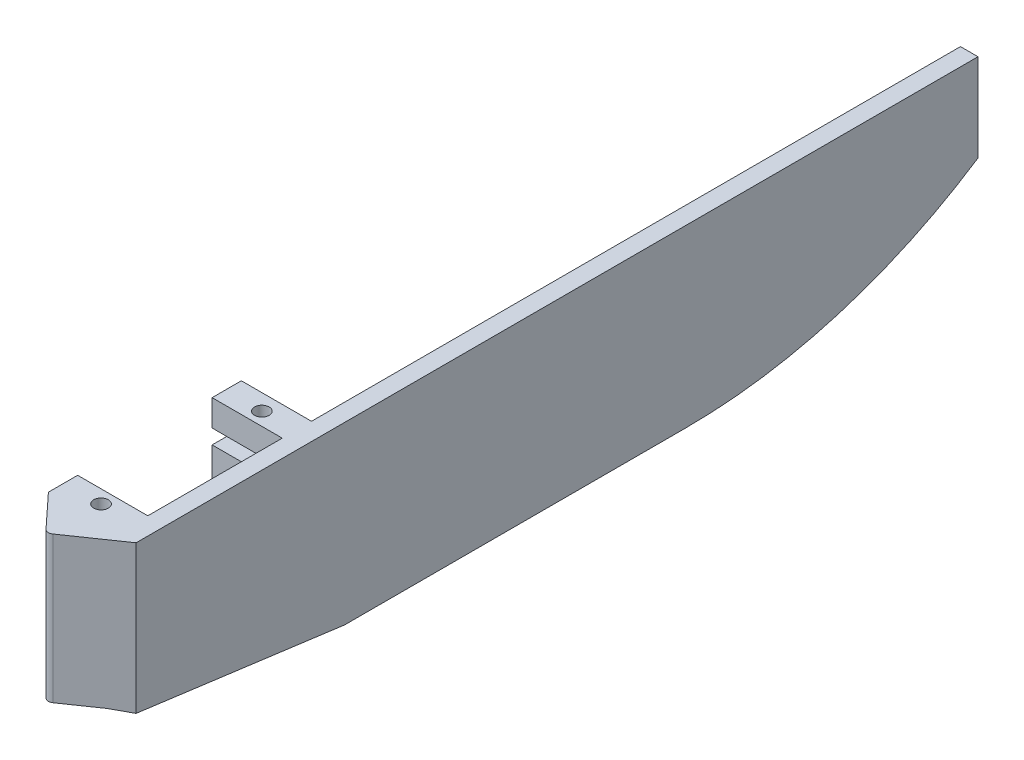
ISO-10303-21;
HEADER;
FILE_DESCRIPTION(('STEP AP214'),'2;1');
FILE_NAME('part.step','',(''),(''),'','','');
FILE_SCHEMA(('AUTOMOTIVE_DESIGN { 1 0 10303 214 1 1 1 1 }'));
ENDSEC;
DATA;
#1=APPLICATION_CONTEXT('core data for automotive mechanical design processes');
#2=APPLICATION_PROTOCOL_DEFINITION('international standard','automotive_design',2000,#1);
#3=PRODUCT_CONTEXT('',#1,'mechanical');
#4=PRODUCT('Part','Part','',(#3));
#5=PRODUCT_RELATED_PRODUCT_CATEGORY('part','',(#4));
#6=PRODUCT_DEFINITION_FORMATION('','',#4);
#7=PRODUCT_DEFINITION_CONTEXT('part definition',#1,'design');
#8=PRODUCT_DEFINITION('design','',#6,#7);
#9=PRODUCT_DEFINITION_SHAPE('','',#8);
#10=(LENGTH_UNIT() NAMED_UNIT(*) SI_UNIT(.MILLI.,.METRE.));
#11=(NAMED_UNIT(*) PLANE_ANGLE_UNIT() SI_UNIT($,.RADIAN.));
#12=(NAMED_UNIT(*) SI_UNIT($,.STERADIAN.) SOLID_ANGLE_UNIT());
#13=UNCERTAINTY_MEASURE_WITH_UNIT(LENGTH_MEASURE(1.E-05),#10,'distance_accuracy_value','');
#14=(GEOMETRIC_REPRESENTATION_CONTEXT(3) GLOBAL_UNCERTAINTY_ASSIGNED_CONTEXT((#13)) GLOBAL_UNIT_ASSIGNED_CONTEXT((#10,
#11,#12)) REPRESENTATION_CONTEXT('',''));
#15=CARTESIAN_POINT('',(0.,0.,0.));
#16=DIRECTION('',(0.,0.,1.));
#17=DIRECTION('',(1.,0.,0.));
#18=AXIS2_PLACEMENT_3D('',#15,#16,#17);
#19=CARTESIAN_POINT('',(3.,0.,0.));
#20=DIRECTION('',(0.,1.,0.));
#21=DIRECTION('',(0.,0.,1.));
#22=AXIS2_PLACEMENT_3D('',#19,#20,#21);
#23=PLANE('',#22);
#24=DIRECTION('',(1.,0.,0.));
#25=VECTOR('',#24,1.);
#26=CARTESIAN_POINT('',(-11.,0.,-100.));
#27=LINE('',#26,#25);
#28=CARTESIAN_POINT('',(-3.,0.,-100.));
#29=VERTEX_POINT('',#28);
#30=CARTESIAN_POINT('',(0.,0.,-100.));
#31=VERTEX_POINT('',#30);
#32=EDGE_CURVE('E250',#29,#31,#27,.T.);
#33=ORIENTED_EDGE('',*,*,#32,.T.);
#34=DIRECTION('',(0.,0.,1.));
#35=VECTOR('',#34,1.);
#36=CARTESIAN_POINT('',(0.,0.,0.));
#37=LINE('',#36,#35);
#38=CARTESIAN_POINT('',(0.,0.,-41.6596314448645));
#39=VERTEX_POINT('',#38);
#40=EDGE_CURVE('E75',#31,#39,#37,.T.);
#41=ORIENTED_EDGE('',*,*,#40,.T.);
#42=DIRECTION('',(1.,0.,0.));
#43=VECTOR('',#42,1.);
#44=CARTESIAN_POINT('',(-11.,0.,-41.6596314448645));
#45=LINE('',#44,#43);
#46=CARTESIAN_POINT('',(-3.,0.,-41.6596314448645));
#47=VERTEX_POINT('',#46);
#48=EDGE_CURVE('E245',#47,#39,#45,.T.);
#49=ORIENTED_EDGE('',*,*,#48,.F.);
#50=DIRECTION('',(0.,0.,-1.));
#51=VECTOR('',#50,1.);
#52=CARTESIAN_POINT('',(-3.,0.,0.));
#53=LINE('',#52,#51);
#54=EDGE_CURVE('E430',#47,#29,#53,.T.);
#55=ORIENTED_EDGE('',*,*,#54,.T.);
#56=EDGE_LOOP('',(#33,#41,#49,#55));
#57=FACE_BOUND('',#56,.T.);
#58=ADVANCED_FACE('F61',(#57),#23,.F.);
#59=CARTESIAN_POINT('',(-3.,0.,0.));
#60=DIRECTION('',(1.,0.,0.));
#61=DIRECTION('',(0.,0.,1.));
#62=AXIS2_PLACEMENT_3D('',#59,#60,#61);
#63=PLANE('',#62);
#64=DIRECTION('',(0.,0.,1.));
#65=VECTOR('',#64,1.);
#66=CARTESIAN_POINT('',(-3.,23.000001474005,-34.0036422578905));
#67=LINE('',#66,#65);
#68=CARTESIAN_POINT('',(-3.,23.000001474005,-39.0036422578905));
#69=VERTEX_POINT('',#68);
#70=CARTESIAN_POINT('',(-3.,23.000001474005,-34.0036422578905));
#71=VERTEX_POINT('',#70);
#72=EDGE_CURVE('E320',#69,#71,#67,.T.);
#73=ORIENTED_EDGE('',*,*,#72,.T.);
#74=DIRECTION('',(0.,-1.,0.));
#75=VECTOR('',#74,1.);
#76=CARTESIAN_POINT('',(-3.,23.000001474005,-34.0036422578905));
#77=LINE('',#76,#75);
#78=CARTESIAN_POINT('',(-3.,18.000001474005,-34.0036422578905));
#79=VERTEX_POINT('',#78);
#80=EDGE_CURVE('E303',#71,#79,#77,.T.);
#81=ORIENTED_EDGE('',*,*,#80,.T.);
#82=DIRECTION('',(0.,0.,-1.));
#83=VECTOR('',#82,1.);
#84=CARTESIAN_POINT('',(-3.,18.000001474005,-34.0036422578905));
#85=LINE('',#84,#83);
#86=CARTESIAN_POINT('',(-3.,18.000001474005,-39.0036422578905));
#87=VERTEX_POINT('',#86);
#88=EDGE_CURVE('E308',#79,#87,#85,.T.);
#89=ORIENTED_EDGE('',*,*,#88,.T.);
#90=DIRECTION('',(0.,1.,0.));
#91=VECTOR('',#90,1.);
#92=CARTESIAN_POINT('',(-3.,23.000001474005,-39.0036422578905));
#93=LINE('',#92,#91);
#94=EDGE_CURVE('E323',#87,#69,#93,.T.);
#95=ORIENTED_EDGE('',*,*,#94,.T.);
#96=EDGE_LOOP('',(#73,#81,#89,#95));
#97=FACE_BOUND('',#96,.T.);
#98=CARTESIAN_POINT('',(-3.,90.8333333333333,-100.));
#99=DIRECTION('',(-1.,0.,0.));
#100=DIRECTION('',(0.,0.,1.));
#101=AXIS2_PLACEMENT_3D('',#98,#99,#100);
#102=CIRCLE('',#101,90.8333333333333);
#103=CARTESIAN_POINT('',(-3.,15.,-150.));
#104=VERTEX_POINT('',#103);
#105=EDGE_CURVE('E439',#104,#29,#102,.T.);
#106=ORIENTED_EDGE('',*,*,#105,.T.);
#107=ORIENTED_EDGE('',*,*,#54,.F.);
#108=DIRECTION('',(0.,0.131367240534839,0.991333772305908));
#109=VECTOR('',#108,1.);
#110=CARTESIAN_POINT('',(-3.,5.,-3.92823934627651));
#111=LINE('',#110,#109);
#112=CARTESIAN_POINT('',(-3.,5.,-3.92823934627651));
#113=VERTEX_POINT('',#112);
#114=EDGE_CURVE('E443',#47,#113,#111,.T.);
#115=ORIENTED_EDGE('',*,*,#114,.T.);
#116=DIRECTION('',(0.,0.,-1.));
#117=VECTOR('',#116,1.);
#118=CARTESIAN_POINT('',(-3.,5.,7.99635774210946));
#119=LINE('',#118,#117);
#120=CARTESIAN_POINT('',(-3.,5.,-6.00364225789055));
#121=VERTEX_POINT('',#120);
#122=EDGE_CURVE('E457',#113,#121,#119,.T.);
#123=ORIENTED_EDGE('',*,*,#122,.T.);
#124=DIRECTION('',(0.,1.,0.));
#125=VECTOR('',#124,1.);
#126=CARTESIAN_POINT('',(-3.,18.000001474005,-6.00364225789055));
#127=LINE('',#126,#125);
#128=CARTESIAN_POINT('',(-3.,18.000001474005,-6.00364225789055));
#129=VERTEX_POINT('',#128);
#130=EDGE_CURVE('E371',#121,#129,#127,.T.);
#131=ORIENTED_EDGE('',*,*,#130,.T.);
#132=DIRECTION('',(0.,0.,-1.));
#133=VECTOR('',#132,1.);
#134=CARTESIAN_POINT('',(-3.,18.000001474005,-6.00364225789055));
#135=LINE('',#134,#133);
#136=CARTESIAN_POINT('',(-3.,18.000001474005,-11.0036422578906));
#137=VERTEX_POINT('',#136);
#138=EDGE_CURVE('E406',#129,#137,#135,.T.);
#139=ORIENTED_EDGE('',*,*,#138,.T.);
#140=DIRECTION('',(0.,1.,0.));
#141=VECTOR('',#140,1.);
#142=CARTESIAN_POINT('',(-3.,23.000001474005,-11.0036422578905));
#143=LINE('',#142,#141);
#144=CARTESIAN_POINT('',(-3.,23.000001474005,-11.0036422578905));
#145=VERTEX_POINT('',#144);
#146=EDGE_CURVE('E403',#137,#145,#143,.T.);
#147=ORIENTED_EDGE('',*,*,#146,.T.);
#148=DIRECTION('',(0.,0.,1.));
#149=VECTOR('',#148,1.);
#150=CARTESIAN_POINT('',(-3.,23.000001474005,-6.00364225789055));
#151=LINE('',#150,#149);
#152=CARTESIAN_POINT('',(-3.,23.000001474005,-6.00364225789055));
#153=VERTEX_POINT('',#152);
#154=EDGE_CURVE('E400',#145,#153,#151,.T.);
#155=ORIENTED_EDGE('',*,*,#154,.T.);
#156=DIRECTION('',(0.,1.,0.));
#157=VECTOR('',#156,1.);
#158=CARTESIAN_POINT('',(-3.,25.500001474005,-6.00364225789055));
#159=LINE('',#158,#157);
#160=CARTESIAN_POINT('',(-3.,25.500001474005,-6.00364225789055));
#161=VERTEX_POINT('',#160);
#162=EDGE_CURVE('E397',#153,#161,#159,.T.);
#163=ORIENTED_EDGE('',*,*,#162,.T.);
#164=DIRECTION('',(0.,0.,-1.));
#165=VECTOR('',#164,1.);
#166=CARTESIAN_POINT('',(-3.,25.500001474005,-6.00364225789055));
#167=LINE('',#166,#165);
#168=CARTESIAN_POINT('',(-3.,25.500001474005,-11.));
#169=VERTEX_POINT('',#168);
#170=EDGE_CURVE('E394',#161,#169,#167,.T.);
#171=ORIENTED_EDGE('',*,*,#170,.T.);
#172=DIRECTION('',(0.,1.,0.));
#173=VECTOR('',#172,1.);
#174=CARTESIAN_POINT('',(-3.,30.,-11.));
#175=LINE('',#174,#173);
#176=CARTESIAN_POINT('',(-3.,30.,-11.));
#177=VERTEX_POINT('',#176);
#178=EDGE_CURVE('E366',#169,#177,#175,.T.);
#179=ORIENTED_EDGE('',*,*,#178,.T.);
#180=DIRECTION('',(0.,0.,1.));
#181=VECTOR('',#180,1.);
#182=CARTESIAN_POINT('',(-3.,30.,0.));
#183=LINE('',#182,#181);
#184=CARTESIAN_POINT('',(-3.,30.,-34.));
#185=VERTEX_POINT('',#184);
#186=EDGE_CURVE('E426',#185,#177,#183,.T.);
#187=ORIENTED_EDGE('',*,*,#186,.F.);
#188=DIRECTION('',(0.,-1.,0.));
#189=VECTOR('',#188,1.);
#190=CARTESIAN_POINT('',(-3.,30.,-34.));
#191=LINE('',#190,#189);
#192=CARTESIAN_POINT('',(-3.,25.5,-34.));
#193=VERTEX_POINT('',#192);
#194=EDGE_CURVE('E336',#185,#193,#191,.T.);
#195=ORIENTED_EDGE('',*,*,#194,.T.);
#196=DIRECTION('',(0.,0.,-1.));
#197=VECTOR('',#196,1.);
#198=CARTESIAN_POINT('',(-3.,25.5,-34.));
#199=LINE('',#198,#197);
#200=CARTESIAN_POINT('',(-3.,25.5,-39.));
#201=VERTEX_POINT('',#200);
#202=EDGE_CURVE('E341',#193,#201,#199,.T.);
#203=ORIENTED_EDGE('',*,*,#202,.T.);
#204=DIRECTION('',(0.,1.,0.));
#205=VECTOR('',#204,1.);
#206=CARTESIAN_POINT('',(-3.,30.,-39.));
#207=LINE('',#206,#205);
#208=CARTESIAN_POINT('',(-3.,30.,-39.));
#209=VERTEX_POINT('',#208);
#210=EDGE_CURVE('E353',#201,#209,#207,.T.);
#211=ORIENTED_EDGE('',*,*,#210,.T.);
#212=CARTESIAN_POINT('',(-3.,30.,-150.));
#213=VERTEX_POINT('',#212);
#214=EDGE_CURVE('E427',#213,#209,#183,.T.);
#215=ORIENTED_EDGE('',*,*,#214,.F.);
#216=DIRECTION('',(0.,1.,0.));
#217=VECTOR('',#216,1.);
#218=CARTESIAN_POINT('',(-3.,0.,-150.));
#219=LINE('',#218,#217);
#220=EDGE_CURVE('E242',#104,#213,#219,.T.);
#221=ORIENTED_EDGE('',*,*,#220,.F.);
#222=EDGE_LOOP('',(#106,#107,#115,#123,#131,#139,#147,#155,#163,#171,#179,#187,#195,#203,#211,
#215,#221));
#223=FACE_BOUND('',#222,.T.);
#224=ADVANCED_FACE('F441',(#97,#223),#63,.F.);
#225=CARTESIAN_POINT('',(3.,0.,-150.));
#226=DIRECTION('',(0.,0.,1.));
#227=DIRECTION('',(0.,-1.,0.));
#228=AXIS2_PLACEMENT_3D('',#225,#226,#227);
#229=PLANE('',#228);
#230=DIRECTION('',(-1.,0.,0.));
#231=VECTOR('',#230,1.);
#232=CARTESIAN_POINT('',(3.,30.,-150.));
#233=LINE('',#232,#231);
#234=CARTESIAN_POINT('',(0.,30.,-150.));
#235=VERTEX_POINT('',#234);
#236=EDGE_CURVE('E234',#235,#213,#233,.T.);
#237=ORIENTED_EDGE('',*,*,#236,.F.);
#238=DIRECTION('',(0.,-1.,0.));
#239=VECTOR('',#238,1.);
#240=CARTESIAN_POINT('',(0.,0.,-150.));
#241=LINE('',#240,#239);
#242=CARTESIAN_POINT('',(0.,15.,-150.));
#243=VERTEX_POINT('',#242);
#244=EDGE_CURVE('E221',#235,#243,#241,.T.);
#245=ORIENTED_EDGE('',*,*,#244,.T.);
#246=DIRECTION('',(1.,0.,0.));
#247=VECTOR('',#246,1.);
#248=CARTESIAN_POINT('',(-11.,15.,-150.));
#249=LINE('',#248,#247);
#250=EDGE_CURVE('E247',#243,#104,#249,.F.);
#251=ORIENTED_EDGE('',*,*,#250,.T.);
#252=ORIENTED_EDGE('',*,*,#220,.T.);
#253=EDGE_LOOP('',(#237,#245,#251,#252));
#254=FACE_BOUND('',#253,.T.);
#255=ADVANCED_FACE('F240',(#254),#229,.F.);
#256=CARTESIAN_POINT('',(-2.80553359357088,-3.00000000000002,-4.0625352960468));
#257=DIRECTION('',(-0.568252394620736,0.,-0.822854310317324));
#258=DIRECTION('',(-0.822854310317324,0.,0.568252394620736));
#259=AXIS2_PLACEMENT_3D('',#256,#257,#258);
#260=PLANE('',#259);
#261=DIRECTION('',(-0.820531211655288,0.075089741146122,0.566648093153161));
#262=VECTOR('',#261,1.);
#263=CARTESIAN_POINT('',(-2.31372227613483,4.93719627491631,-4.40217374155344));
#264=LINE('',#263,#262);
#265=CARTESIAN_POINT('',(0.,4.72545928754627,-6.));
#266=VERTEX_POINT('',#265);
#267=EDGE_CURVE('E446',#266,#113,#264,.T.);
#268=ORIENTED_EDGE('',*,*,#267,.F.);
#269=DIRECTION('',(0.,1.,0.));
#270=VECTOR('',#269,1.);
#271=CARTESIAN_POINT('',(0.,0.,-6.));
#272=LINE('',#271,#270);
#273=CARTESIAN_POINT('',(0.,30.,-6.));
#274=VERTEX_POINT('',#273);
#275=EDGE_CURVE('E244',#266,#274,#272,.T.);
#276=ORIENTED_EDGE('',*,*,#275,.T.);
#277=DIRECTION('',(-0.822854310317324,0.,0.568252394620736));
#278=VECTOR('',#277,1.);
#279=CARTESIAN_POINT('',(-2.80553359357088,30.,-4.0625352960468));
#280=LINE('',#279,#278);
#281=CARTESIAN_POINT('',(-8.43174760537926,30.,-0.177145689682673));
#282=VERTEX_POINT('',#281);
#283=EDGE_CURVE('E238',#274,#282,#280,.T.);
#284=ORIENTED_EDGE('',*,*,#283,.T.);
#285=DIRECTION('',(0.,1.,0.));
#286=VECTOR('',#285,1.);
#287=CARTESIAN_POINT('',(-8.43174760537926,-3.00000000000002,-0.177145689682673));
#288=LINE('',#287,#286);
#289=CARTESIAN_POINT('',(-8.43174760537926,5.,-0.177145689682676));
#290=VERTEX_POINT('',#289);
#291=EDGE_CURVE('E277',#290,#282,#288,.T.);
#292=ORIENTED_EDGE('',*,*,#291,.F.);
#293=DIRECTION('',(-0.822854310317324,0.,0.568252394620736));
#294=VECTOR('',#293,1.);
#295=CARTESIAN_POINT('',(-2.80553359357088,5.,-4.0625352960468));
#296=LINE('',#295,#294);
#297=EDGE_CURVE('E272',#113,#290,#296,.T.);
#298=ORIENTED_EDGE('',*,*,#297,.F.);
#299=EDGE_LOOP('',(#268,#276,#284,#292,#298));
#300=FACE_BOUND('',#299,.T.);
#301=ADVANCED_FACE('F466',(#300),#260,.F.);
#302=CARTESIAN_POINT('',(-15.,0.,0.));
#303=DIRECTION('',(-1.,0.,0.));
#304=DIRECTION('',(0.,0.,-1.));
#305=AXIS2_PLACEMENT_3D('',#302,#303,#304);
#306=PLANE('',#305);
#307=DIRECTION('',(0.,1.,0.));
#308=VECTOR('',#307,1.);
#309=CARTESIAN_POINT('',(-15.,18.000001474005,-6.00364225789055));
#310=LINE('',#309,#308);
#311=CARTESIAN_POINT('',(-15.,5.,-6.00364225789055));
#312=VERTEX_POINT('',#311);
#313=CARTESIAN_POINT('',(-15.,18.000001474005,-6.00364225789055));
#314=VERTEX_POINT('',#313);
#315=EDGE_CURVE('E386',#312,#314,#310,.T.);
#316=ORIENTED_EDGE('',*,*,#315,.F.);
#317=DIRECTION('',(0.,0.,-1.));
#318=VECTOR('',#317,1.);
#319=CARTESIAN_POINT('',(-15.,5.,7.99635774210946));
#320=LINE('',#319,#318);
#321=CARTESIAN_POINT('',(-15.,5.,-6.));
#322=VERTEX_POINT('',#321);
#323=EDGE_CURVE('E456',#322,#312,#320,.T.);
#324=ORIENTED_EDGE('',*,*,#323,.F.);
#325=DIRECTION('',(0.,1.,0.));
#326=VECTOR('',#325,1.);
#327=CARTESIAN_POINT('',(-15.,0.,-6.));
#328=LINE('',#327,#326);
#329=CARTESIAN_POINT('',(-15.,30.,-6.));
#330=VERTEX_POINT('',#329);
#331=EDGE_CURVE('E255',#322,#330,#328,.T.);
#332=ORIENTED_EDGE('',*,*,#331,.T.);
#333=DIRECTION('',(0.,0.,1.));
#334=VECTOR('',#333,1.);
#335=CARTESIAN_POINT('',(-15.,30.,0.));
#336=LINE('',#335,#334);
#337=CARTESIAN_POINT('',(-15.,30.,-11.));
#338=VERTEX_POINT('',#337);
#339=EDGE_CURVE('E388',#338,#330,#336,.T.);
#340=ORIENTED_EDGE('',*,*,#339,.F.);
#341=DIRECTION('',(0.,1.,0.));
#342=VECTOR('',#341,1.);
#343=CARTESIAN_POINT('',(-15.,30.,-11.));
#344=LINE('',#343,#342);
#345=CARTESIAN_POINT('',(-15.,25.500001474005,-11.));
#346=VERTEX_POINT('',#345);
#347=EDGE_CURVE('E367',#346,#338,#344,.T.);
#348=ORIENTED_EDGE('',*,*,#347,.F.);
#349=DIRECTION('',(0.,0.,-1.));
#350=VECTOR('',#349,1.);
#351=CARTESIAN_POINT('',(-15.,25.500001474005,-6.00364225789055));
#352=LINE('',#351,#350);
#353=CARTESIAN_POINT('',(-15.,25.500001474005,-6.00364225789055));
#354=VERTEX_POINT('',#353);
#355=EDGE_CURVE('E370',#354,#346,#352,.T.);
#356=ORIENTED_EDGE('',*,*,#355,.F.);
#357=DIRECTION('',(0.,1.,0.));
#358=VECTOR('',#357,1.);
#359=CARTESIAN_POINT('',(-15.,25.500001474005,-6.00364225789055));
#360=LINE('',#359,#358);
#361=CARTESIAN_POINT('',(-15.,23.000001474005,-6.00364225789055));
#362=VERTEX_POINT('',#361);
#363=EDGE_CURVE('E374',#362,#354,#360,.T.);
#364=ORIENTED_EDGE('',*,*,#363,.F.);
#365=DIRECTION('',(0.,0.,1.));
#366=VECTOR('',#365,1.);
#367=CARTESIAN_POINT('',(-15.,23.000001474005,-6.00364225789055));
#368=LINE('',#367,#366);
#369=CARTESIAN_POINT('',(-15.,23.000001474005,-11.0036422578905));
#370=VERTEX_POINT('',#369);
#371=EDGE_CURVE('E377',#370,#362,#368,.T.);
#372=ORIENTED_EDGE('',*,*,#371,.F.);
#373=DIRECTION('',(0.,1.,0.));
#374=VECTOR('',#373,1.);
#375=CARTESIAN_POINT('',(-15.,23.000001474005,-11.0036422578905));
#376=LINE('',#375,#374);
#377=CARTESIAN_POINT('',(-15.,18.000001474005,-11.0036422578906));
#378=VERTEX_POINT('',#377);
#379=EDGE_CURVE('E380',#378,#370,#376,.T.);
#380=ORIENTED_EDGE('',*,*,#379,.F.);
#381=DIRECTION('',(0.,0.,-1.));
#382=VECTOR('',#381,1.);
#383=CARTESIAN_POINT('',(-15.,18.000001474005,-6.00364225789055));
#384=LINE('',#383,#382);
#385=EDGE_CURVE('E383',#314,#378,#384,.T.);
#386=ORIENTED_EDGE('',*,*,#385,.F.);
#387=EDGE_LOOP('',(#316,#324,#332,#340,#348,#356,#364,#372,#380,#386));
#388=FACE_BOUND('',#387,.T.);
#389=ADVANCED_FACE('F471',(#388),#306,.T.);
#390=CARTESIAN_POINT('',(-15.,18.000001474005,-6.00364225789055));
#391=DIRECTION('',(0.,0.,-1.));
#392=DIRECTION('',(-1.,0.,0.));
#393=AXIS2_PLACEMENT_3D('',#390,#391,#392);
#394=PLANE('',#393);
#395=ORIENTED_EDGE('',*,*,#130,.F.);
#396=DIRECTION('',(-1.,0.,0.));
#397=VECTOR('',#396,1.);
#398=CARTESIAN_POINT('',(-15.,5.,-6.00364225789055));
#399=LINE('',#398,#397);
#400=EDGE_CURVE('E453',#121,#312,#399,.T.);
#401=ORIENTED_EDGE('',*,*,#400,.T.);
#402=ORIENTED_EDGE('',*,*,#315,.T.);
#403=DIRECTION('',(1.,0.,0.));
#404=VECTOR('',#403,1.);
#405=CARTESIAN_POINT('',(-15.,18.000001474005,-6.00364225789055));
#406=LINE('',#405,#404);
#407=EDGE_CURVE('E412',#314,#129,#406,.T.);
#408=ORIENTED_EDGE('',*,*,#407,.T.);
#409=EDGE_LOOP('',(#395,#401,#402,#408));
#410=FACE_BOUND('',#409,.T.);
#411=ADVANCED_FACE('F476',(#410),#394,.T.);
#412=CARTESIAN_POINT('',(-9.,-3.00000000000002,-1.));
#413=DIRECTION('',(0.,1.,0.));
#414=DIRECTION('',(0.,0.,1.));
#415=AXIS2_PLACEMENT_3D('',#412,#413,#414);
#416=CYLINDRICAL_SURFACE('',#415,1.);
#417=DIRECTION('',(0.,1.,0.));
#418=VECTOR('',#417,1.);
#419=CARTESIAN_POINT('',(-9.73327595839466,-3.00000000000002,-0.320068849926411));
#420=LINE('',#419,#418);
#421=CARTESIAN_POINT('',(-9.73327595839466,5.,-0.320068849926411));
#422=VERTEX_POINT('',#421);
#423=CARTESIAN_POINT('',(-9.73327595839466,30.,-0.320068849926411));
#424=VERTEX_POINT('',#423);
#425=EDGE_CURVE('E261',#422,#424,#420,.T.);
#426=ORIENTED_EDGE('',*,*,#425,.F.);
#427=CARTESIAN_POINT('',(-9.,5.,-1.));
#428=DIRECTION('',(0.,-1.,0.));
#429=DIRECTION('',(0.,0.,-1.));
#430=AXIS2_PLACEMENT_3D('',#427,#428,#429);
#431=CIRCLE('',#430,1.);
#432=EDGE_CURVE('E82',#422,#290,#431,.F.);
#433=ORIENTED_EDGE('',*,*,#432,.T.);
#434=ORIENTED_EDGE('',*,*,#291,.T.);
#435=CARTESIAN_POINT('',(-9.,30.,-1.));
#436=DIRECTION('',(0.,-1.,0.));
#437=DIRECTION('',(0.,0.,1.));
#438=AXIS2_PLACEMENT_3D('',#435,#436,#437);
#439=CIRCLE('',#438,1.);
#440=EDGE_CURVE('E267',#424,#282,#439,.F.);
#441=ORIENTED_EDGE('',*,*,#440,.F.);
#442=EDGE_LOOP('',(#426,#433,#434,#441));
#443=FACE_BOUND('',#442,.T.);
#444=ADVANCED_FACE('F265',(#443),#416,.T.);
#445=CARTESIAN_POINT('',(-5.0739414731185,-3.00000000000002,4.70481927264654));
#446=DIRECTION('',(-0.733275958394658,0.,0.679931150073591));
#447=DIRECTION('',(0.679931150073591,0.,0.733275958394658));
#448=AXIS2_PLACEMENT_3D('',#445,#446,#447);
#449=PLANE('',#448);
#450=ORIENTED_EDGE('',*,*,#331,.F.);
#451=DIRECTION('',(0.679931150073591,0.,0.733275958394658));
#452=VECTOR('',#451,1.);
#453=CARTESIAN_POINT('',(-5.0739414731185,5.,4.70481927264654));
#454=LINE('',#453,#452);
#455=EDGE_CURVE('E68',#322,#422,#454,.T.);
#456=ORIENTED_EDGE('',*,*,#455,.T.);
#457=ORIENTED_EDGE('',*,*,#425,.T.);
#458=DIRECTION('',(0.679931150073591,0.,0.733275958394658));
#459=VECTOR('',#458,1.);
#460=CARTESIAN_POINT('',(-5.0739414731185,30.,4.70481927264654));
#461=LINE('',#460,#459);
#462=EDGE_CURVE('E269',#330,#424,#461,.T.);
#463=ORIENTED_EDGE('',*,*,#462,.F.);
#464=EDGE_LOOP('',(#450,#456,#457,#463));
#465=FACE_BOUND('',#464,.T.);
#466=ADVANCED_FACE('F259',(#465),#449,.T.);
#467=CARTESIAN_POINT('',(3.,30.,0.));
#468=DIRECTION('',(0.,-1.,0.));
#469=DIRECTION('',(0.,0.,-1.));
#470=AXIS2_PLACEMENT_3D('',#467,#468,#469);
#471=PLANE('',#470);
#472=CARTESIAN_POINT('',(-8.75,30.,-36.25));
#473=DIRECTION('',(0.,-1.,0.));
#474=DIRECTION('',(0.,0.,1.));
#475=AXIS2_PLACEMENT_3D('',#472,#473,#474);
#476=CIRCLE('',#475,1.25);
#477=CARTESIAN_POINT('',(-8.75,30.,-35.));
#478=VERTEX_POINT('',#477);
#479=EDGE_CURVE('E284',#478,#478,#476,.T.);
#480=ORIENTED_EDGE('',*,*,#479,.T.);
#481=EDGE_LOOP('',(#480));
#482=FACE_BOUND('',#481,.T.);
#483=CARTESIAN_POINT('',(-8.75,30.,-8.75));
#484=DIRECTION('',(0.,-1.,0.));
#485=DIRECTION('',(0.,0.,1.));
#486=AXIS2_PLACEMENT_3D('',#483,#484,#485);
#487=CIRCLE('',#486,1.25);
#488=CARTESIAN_POINT('',(-8.75,30.,-7.5));
#489=VERTEX_POINT('',#488);
#490=EDGE_CURVE('E279',#489,#489,#487,.T.);
#491=ORIENTED_EDGE('',*,*,#490,.T.);
#492=EDGE_LOOP('',(#491));
#493=FACE_BOUND('',#492,.T.);
#494=ORIENTED_EDGE('',*,*,#283,.F.);
#495=DIRECTION('',(0.,0.,1.));
#496=VECTOR('',#495,1.);
#497=CARTESIAN_POINT('',(0.,30.,0.));
#498=LINE('',#497,#496);
#499=EDGE_CURVE('E224',#235,#274,#498,.T.);
#500=ORIENTED_EDGE('',*,*,#499,.F.);
#501=ORIENTED_EDGE('',*,*,#236,.T.);
#502=ORIENTED_EDGE('',*,*,#214,.T.);
#503=DIRECTION('',(1.,0.,0.));
#504=VECTOR('',#503,1.);
#505=CARTESIAN_POINT('',(-15.,30.,-39.));
#506=LINE('',#505,#504);
#507=CARTESIAN_POINT('',(-15.,30.,-39.));
#508=VERTEX_POINT('',#507);
#509=EDGE_CURVE('E362',#508,#209,#506,.T.);
#510=ORIENTED_EDGE('',*,*,#509,.F.);
#511=DIRECTION('',(0.,0.,1.));
#512=VECTOR('',#511,1.);
#513=CARTESIAN_POINT('',(-15.,30.,-34.));
#514=LINE('',#513,#512);
#515=CARTESIAN_POINT('',(-15.,30.,-34.));
#516=VERTEX_POINT('',#515);
#517=EDGE_CURVE('E340',#508,#516,#514,.T.);
#518=ORIENTED_EDGE('',*,*,#517,.T.);
#519=DIRECTION('',(1.,0.,0.));
#520=VECTOR('',#519,1.);
#521=CARTESIAN_POINT('',(-15.,30.,-34.));
#522=LINE('',#521,#520);
#523=EDGE_CURVE('E364',#516,#185,#522,.T.);
#524=ORIENTED_EDGE('',*,*,#523,.T.);
#525=ORIENTED_EDGE('',*,*,#186,.T.);
#526=DIRECTION('',(1.,0.,0.));
#527=VECTOR('',#526,1.);
#528=CARTESIAN_POINT('',(-15.,30.,-11.));
#529=LINE('',#528,#527);
#530=EDGE_CURVE('E391',#338,#177,#529,.T.);
#531=ORIENTED_EDGE('',*,*,#530,.F.);
#532=ORIENTED_EDGE('',*,*,#339,.T.);
#533=ORIENTED_EDGE('',*,*,#462,.T.);
#534=ORIENTED_EDGE('',*,*,#440,.T.);
#535=EDGE_LOOP('',(#494,#500,#501,#502,#510,#518,#524,#525,#531,#532,#533,#534));
#536=FACE_BOUND('',#535,.T.);
#537=ADVANCED_FACE('F232',(#482,#493,#536),#471,.F.);
#538=CARTESIAN_POINT('',(-11.,5.,-3.92823934627651));
#539=DIRECTION('',(0.,0.991333772305908,-0.131367240534839));
#540=DIRECTION('',(0.,0.131367240534839,0.991333772305908));
#541=AXIS2_PLACEMENT_3D('',#538,#539,#540);
#542=PLANE('',#541);
#543=ORIENTED_EDGE('',*,*,#48,.T.);
#544=DIRECTION('',(0.,0.131367240534839,0.991333772305908));
#545=VECTOR('',#544,1.);
#546=CARTESIAN_POINT('',(0.,5.,-3.92823934627651));
#547=LINE('',#546,#545);
#548=EDGE_CURVE('E444',#39,#266,#547,.T.);
#549=ORIENTED_EDGE('',*,*,#548,.T.);
#550=ORIENTED_EDGE('',*,*,#267,.T.);
#551=ORIENTED_EDGE('',*,*,#114,.F.);
#552=EDGE_LOOP('',(#543,#549,#550,#551));
#553=FACE_BOUND('',#552,.T.);
#554=ADVANCED_FACE('F481',(#553),#542,.F.);
#555=CARTESIAN_POINT('',(-11.,90.8333333333333,-100.));
#556=DIRECTION('',(1.,0.,0.));
#557=DIRECTION('',(0.,0.,-1.));
#558=AXIS2_PLACEMENT_3D('',#555,#556,#557);
#559=CYLINDRICAL_SURFACE('',#558,90.8333333333333);
#560=ORIENTED_EDGE('',*,*,#250,.F.);
#561=CARTESIAN_POINT('',(0.,90.8333333333333,-100.));
#562=DIRECTION('',(-1.,0.,0.));
#563=DIRECTION('',(0.,0.,1.));
#564=AXIS2_PLACEMENT_3D('',#561,#562,#563);
#565=CIRCLE('',#564,90.8333333333333);
#566=EDGE_CURVE('E12',#243,#31,#565,.T.);
#567=ORIENTED_EDGE('',*,*,#566,.T.);
#568=ORIENTED_EDGE('',*,*,#32,.F.);
#569=ORIENTED_EDGE('',*,*,#105,.F.);
#570=EDGE_LOOP('',(#560,#567,#568,#569));
#571=FACE_BOUND('',#570,.T.);
#572=ADVANCED_FACE('F438',(#571),#559,.T.);
#573=CARTESIAN_POINT('',(-15.,30.,-11.));
#574=DIRECTION('',(0.,0.,-1.));
#575=DIRECTION('',(-1.,0.,0.));
#576=AXIS2_PLACEMENT_3D('',#573,#574,#575);
#577=PLANE('',#576);
#578=ORIENTED_EDGE('',*,*,#178,.F.);
#579=DIRECTION('',(1.,0.,0.));
#580=VECTOR('',#579,1.);
#581=CARTESIAN_POINT('',(-15.,25.500001474005,-11.));
#582=LINE('',#581,#580);
#583=EDGE_CURVE('E423',#346,#169,#582,.T.);
#584=ORIENTED_EDGE('',*,*,#583,.F.);
#585=ORIENTED_EDGE('',*,*,#347,.T.);
#586=ORIENTED_EDGE('',*,*,#530,.T.);
#587=EDGE_LOOP('',(#578,#584,#585,#586));
#588=FACE_BOUND('',#587,.T.);
#589=ADVANCED_FACE('F488',(#588),#577,.T.);
#590=CARTESIAN_POINT('',(-15.,25.500001474005,-6.00364225789055));
#591=DIRECTION('',(0.,-1.,0.));
#592=DIRECTION('',(0.,0.,-1.));
#593=AXIS2_PLACEMENT_3D('',#590,#591,#592);
#594=PLANE('',#593);
#595=CARTESIAN_POINT('',(-8.75,25.500001474005,-8.75));
#596=DIRECTION('',(0.,-1.,0.));
#597=DIRECTION('',(0.,0.,-1.));
#598=AXIS2_PLACEMENT_3D('',#595,#596,#597);
#599=CIRCLE('',#598,1.25);
#600=CARTESIAN_POINT('',(-8.75,25.500001474005,-10.));
#601=VERTEX_POINT('',#600);
#602=EDGE_CURVE('E300',#601,#601,#599,.F.);
#603=ORIENTED_EDGE('',*,*,#602,.T.);
#604=EDGE_LOOP('',(#603));
#605=FACE_BOUND('',#604,.T.);
#606=ORIENTED_EDGE('',*,*,#170,.F.);
#607=DIRECTION('',(1.,0.,0.));
#608=VECTOR('',#607,1.);
#609=CARTESIAN_POINT('',(-15.,25.500001474005,-6.00364225789055));
#610=LINE('',#609,#608);
#611=EDGE_CURVE('E421',#354,#161,#610,.T.);
#612=ORIENTED_EDGE('',*,*,#611,.F.);
#613=ORIENTED_EDGE('',*,*,#355,.T.);
#614=ORIENTED_EDGE('',*,*,#583,.T.);
#615=EDGE_LOOP('',(#606,#612,#613,#614));
#616=FACE_BOUND('',#615,.T.);
#617=ADVANCED_FACE('F504',(#605,#616),#594,.T.);
#618=CARTESIAN_POINT('',(-15.,25.500001474005,-6.00364225789055));
#619=DIRECTION('',(0.,0.,-1.));
#620=DIRECTION('',(0.,1.,0.));
#621=AXIS2_PLACEMENT_3D('',#618,#619,#620);
#622=PLANE('',#621);
#623=ORIENTED_EDGE('',*,*,#162,.F.);
#624=DIRECTION('',(1.,0.,0.));
#625=VECTOR('',#624,1.);
#626=CARTESIAN_POINT('',(-15.,23.000001474005,-6.00364225789055));
#627=LINE('',#626,#625);
#628=EDGE_CURVE('E419',#362,#153,#627,.T.);
#629=ORIENTED_EDGE('',*,*,#628,.F.);
#630=ORIENTED_EDGE('',*,*,#363,.T.);
#631=ORIENTED_EDGE('',*,*,#611,.T.);
#632=EDGE_LOOP('',(#623,#629,#630,#631));
#633=FACE_BOUND('',#632,.T.);
#634=ADVANCED_FACE('F508',(#633),#622,.T.);
#635=CARTESIAN_POINT('',(-15.,23.000001474005,-6.00364225789055));
#636=DIRECTION('',(0.,1.,0.));
#637=DIRECTION('',(0.,0.,1.));
#638=AXIS2_PLACEMENT_3D('',#635,#636,#637);
#639=PLANE('',#638);
#640=CARTESIAN_POINT('',(-8.75,23.000001474005,-8.75));
#641=DIRECTION('',(0.,1.,0.));
#642=DIRECTION('',(0.,0.,1.));
#643=AXIS2_PLACEMENT_3D('',#640,#641,#642);
#644=CIRCLE('',#643,1.25);
#645=CARTESIAN_POINT('',(-8.75,23.000001474005,-7.5));
#646=VERTEX_POINT('',#645);
#647=EDGE_CURVE('E297',#646,#646,#644,.F.);
#648=ORIENTED_EDGE('',*,*,#647,.T.);
#649=EDGE_LOOP('',(#648));
#650=FACE_BOUND('',#649,.T.);
#651=ORIENTED_EDGE('',*,*,#154,.F.);
#652=DIRECTION('',(1.,0.,0.));
#653=VECTOR('',#652,1.);
#654=CARTESIAN_POINT('',(-15.,23.000001474005,-11.0036422578905));
#655=LINE('',#654,#653);
#656=EDGE_CURVE('E417',#370,#145,#655,.T.);
#657=ORIENTED_EDGE('',*,*,#656,.F.);
#658=ORIENTED_EDGE('',*,*,#371,.T.);
#659=ORIENTED_EDGE('',*,*,#628,.T.);
#660=EDGE_LOOP('',(#651,#657,#658,#659));
#661=FACE_BOUND('',#660,.T.);
#662=ADVANCED_FACE('F512',(#650,#661),#639,.T.);
#663=CARTESIAN_POINT('',(-15.,23.000001474005,-11.0036422578905));
#664=DIRECTION('',(0.,0.,-1.));
#665=DIRECTION('',(0.,1.,0.));
#666=AXIS2_PLACEMENT_3D('',#663,#664,#665);
#667=PLANE('',#666);
#668=ORIENTED_EDGE('',*,*,#146,.F.);
#669=DIRECTION('',(1.,0.,0.));
#670=VECTOR('',#669,1.);
#671=CARTESIAN_POINT('',(-15.,18.000001474005,-11.0036422578906));
#672=LINE('',#671,#670);
#673=EDGE_CURVE('E415',#378,#137,#672,.T.);
#674=ORIENTED_EDGE('',*,*,#673,.F.);
#675=ORIENTED_EDGE('',*,*,#379,.T.);
#676=ORIENTED_EDGE('',*,*,#656,.T.);
#677=EDGE_LOOP('',(#668,#674,#675,#676));
#678=FACE_BOUND('',#677,.T.);
#679=ADVANCED_FACE('F516',(#678),#667,.T.);
#680=CARTESIAN_POINT('',(-15.,18.000001474005,-6.00364225789055));
#681=DIRECTION('',(0.,-1.,0.));
#682=DIRECTION('',(0.,0.,-1.));
#683=AXIS2_PLACEMENT_3D('',#680,#681,#682);
#684=PLANE('',#683);
#685=CARTESIAN_POINT('',(-8.75,18.,-8.75));
#686=DIRECTION('',(0.,-1.,0.));
#687=DIRECTION('',(0.,0.,1.));
#688=AXIS2_PLACEMENT_3D('',#685,#686,#687);
#689=CIRCLE('',#688,1.25);
#690=CARTESIAN_POINT('',(-8.75,18.,-7.5));
#691=VERTEX_POINT('',#690);
#692=EDGE_CURVE('E287',#691,#691,#689,.T.);
#693=ORIENTED_EDGE('',*,*,#692,.F.);
#694=EDGE_LOOP('',(#693));
#695=FACE_BOUND('',#694,.T.);
#696=ORIENTED_EDGE('',*,*,#138,.F.);
#697=ORIENTED_EDGE('',*,*,#407,.F.);
#698=ORIENTED_EDGE('',*,*,#385,.T.);
#699=ORIENTED_EDGE('',*,*,#673,.T.);
#700=EDGE_LOOP('',(#696,#697,#698,#699));
#701=FACE_BOUND('',#700,.T.);
#702=ADVANCED_FACE('F520',(#695,#701),#684,.T.);
#703=CARTESIAN_POINT('',(-15.,30.,-34.));
#704=DIRECTION('',(0.,0.,1.));
#705=DIRECTION('',(0.,-1.,0.));
#706=AXIS2_PLACEMENT_3D('',#703,#704,#705);
#707=PLANE('',#706);
#708=ORIENTED_EDGE('',*,*,#194,.F.);
#709=ORIENTED_EDGE('',*,*,#523,.F.);
#710=DIRECTION('',(0.,-1.,0.));
#711=VECTOR('',#710,1.);
#712=CARTESIAN_POINT('',(-15.,30.,-34.));
#713=LINE('',#712,#711);
#714=CARTESIAN_POINT('',(-15.,25.5,-34.));
#715=VERTEX_POINT('',#714);
#716=EDGE_CURVE('E337',#516,#715,#713,.T.);
#717=ORIENTED_EDGE('',*,*,#716,.T.);
#718=DIRECTION('',(1.,0.,0.));
#719=VECTOR('',#718,1.);
#720=CARTESIAN_POINT('',(-15.,25.5,-34.));
#721=LINE('',#720,#719);
#722=EDGE_CURVE('E350',#715,#193,#721,.T.);
#723=ORIENTED_EDGE('',*,*,#722,.T.);
#724=EDGE_LOOP('',(#708,#709,#717,#723));
#725=FACE_BOUND('',#724,.T.);
#726=ADVANCED_FACE('F524',(#725),#707,.T.);
#727=CARTESIAN_POINT('',(-15.,30.,-39.));
#728=DIRECTION('',(0.,0.,-1.));
#729=DIRECTION('',(0.,1.,0.));
#730=AXIS2_PLACEMENT_3D('',#727,#728,#729);
#731=PLANE('',#730);
#732=ORIENTED_EDGE('',*,*,#210,.F.);
#733=DIRECTION('',(1.,0.,0.));
#734=VECTOR('',#733,1.);
#735=CARTESIAN_POINT('',(-15.,25.5,-39.));
#736=LINE('',#735,#734);
#737=CARTESIAN_POINT('',(-15.,25.5,-39.));
#738=VERTEX_POINT('',#737);
#739=EDGE_CURVE('E359',#738,#201,#736,.T.);
#740=ORIENTED_EDGE('',*,*,#739,.F.);
#741=DIRECTION('',(0.,1.,0.));
#742=VECTOR('',#741,1.);
#743=CARTESIAN_POINT('',(-15.,30.,-39.));
#744=LINE('',#743,#742);
#745=EDGE_CURVE('E344',#738,#508,#744,.T.);
#746=ORIENTED_EDGE('',*,*,#745,.T.);
#747=ORIENTED_EDGE('',*,*,#509,.T.);
#748=EDGE_LOOP('',(#732,#740,#746,#747));
#749=FACE_BOUND('',#748,.T.);
#750=ADVANCED_FACE('F532',(#749),#731,.T.);
#751=CARTESIAN_POINT('',(-15.,25.5,-34.));
#752=DIRECTION('',(0.,-1.,0.));
#753=DIRECTION('',(0.,0.,-1.));
#754=AXIS2_PLACEMENT_3D('',#751,#752,#753);
#755=PLANE('',#754);
#756=CARTESIAN_POINT('',(-8.75,25.5,-36.25));
#757=DIRECTION('',(0.,-1.,0.));
#758=DIRECTION('',(0.,0.,-1.));
#759=AXIS2_PLACEMENT_3D('',#756,#757,#758);
#760=CIRCLE('',#759,1.25);
#761=CARTESIAN_POINT('',(-8.75,25.5,-37.5));
#762=VERTEX_POINT('',#761);
#763=EDGE_CURVE('E294',#762,#762,#760,.F.);
#764=ORIENTED_EDGE('',*,*,#763,.T.);
#765=EDGE_LOOP('',(#764));
#766=FACE_BOUND('',#765,.T.);
#767=ORIENTED_EDGE('',*,*,#202,.F.);
#768=ORIENTED_EDGE('',*,*,#722,.F.);
#769=DIRECTION('',(0.,0.,-1.));
#770=VECTOR('',#769,1.);
#771=CARTESIAN_POINT('',(-15.,25.5,-34.));
#772=LINE('',#771,#770);
#773=EDGE_CURVE('E347',#715,#738,#772,.T.);
#774=ORIENTED_EDGE('',*,*,#773,.T.);
#775=ORIENTED_EDGE('',*,*,#739,.T.);
#776=EDGE_LOOP('',(#767,#768,#774,#775));
#777=FACE_BOUND('',#776,.T.);
#778=ADVANCED_FACE('F536',(#766,#777),#755,.T.);
#779=CARTESIAN_POINT('',(-15.,0.,0.));
#780=DIRECTION('',(-1.,0.,0.));
#781=DIRECTION('',(0.,0.,-1.));
#782=AXIS2_PLACEMENT_3D('',#779,#780,#781);
#783=PLANE('',#782);
#784=ORIENTED_EDGE('',*,*,#716,.F.);
#785=ORIENTED_EDGE('',*,*,#517,.F.);
#786=ORIENTED_EDGE('',*,*,#745,.F.);
#787=ORIENTED_EDGE('',*,*,#773,.F.);
#788=EDGE_LOOP('',(#784,#785,#786,#787));
#789=FACE_BOUND('',#788,.T.);
#790=ADVANCED_FACE('F540',(#789),#783,.T.);
#791=CARTESIAN_POINT('',(-15.,23.000001474005,-34.0036422578905));
#792=DIRECTION('',(0.,0.,1.));
#793=DIRECTION('',(1.,0.,0.));
#794=AXIS2_PLACEMENT_3D('',#791,#792,#793);
#795=PLANE('',#794);
#796=ORIENTED_EDGE('',*,*,#80,.F.);
#797=DIRECTION('',(1.,0.,0.));
#798=VECTOR('',#797,1.);
#799=CARTESIAN_POINT('',(-15.,23.000001474005,-34.0036422578905));
#800=LINE('',#799,#798);
#801=CARTESIAN_POINT('',(-15.,23.000001474005,-34.0036422578905));
#802=VERTEX_POINT('',#801);
#803=EDGE_CURVE('E334',#802,#71,#800,.T.);
#804=ORIENTED_EDGE('',*,*,#803,.F.);
#805=DIRECTION('',(0.,-1.,0.));
#806=VECTOR('',#805,1.);
#807=CARTESIAN_POINT('',(-15.,23.000001474005,-34.0036422578905));
#808=LINE('',#807,#806);
#809=CARTESIAN_POINT('',(-15.,18.000001474005,-34.0036422578905));
#810=VERTEX_POINT('',#809);
#811=EDGE_CURVE('E304',#802,#810,#808,.T.);
#812=ORIENTED_EDGE('',*,*,#811,.T.);
#813=DIRECTION('',(1.,0.,0.));
#814=VECTOR('',#813,1.);
#815=CARTESIAN_POINT('',(-15.,18.000001474005,-34.0036422578905));
#816=LINE('',#815,#814);
#817=EDGE_CURVE('E317',#810,#79,#816,.T.);
#818=ORIENTED_EDGE('',*,*,#817,.T.);
#819=EDGE_LOOP('',(#796,#804,#812,#818));
#820=FACE_BOUND('',#819,.T.);
#821=ADVANCED_FACE('F544',(#820),#795,.T.);
#822=CARTESIAN_POINT('',(-15.,23.000001474005,-34.0036422578905));
#823=DIRECTION('',(0.,1.,0.));
#824=DIRECTION('',(0.,0.,1.));
#825=AXIS2_PLACEMENT_3D('',#822,#823,#824);
#826=PLANE('',#825);
#827=CARTESIAN_POINT('',(-8.75,23.000001474005,-36.25));
#828=DIRECTION('',(0.,1.,0.));
#829=DIRECTION('',(0.,0.,1.));
#830=AXIS2_PLACEMENT_3D('',#827,#828,#829);
#831=CIRCLE('',#830,1.25);
#832=CARTESIAN_POINT('',(-8.75,23.000001474005,-35.));
#833=VERTEX_POINT('',#832);
#834=EDGE_CURVE('E283',#833,#833,#831,.F.);
#835=ORIENTED_EDGE('',*,*,#834,.T.);
#836=EDGE_LOOP('',(#835));
#837=FACE_BOUND('',#836,.T.);
#838=ORIENTED_EDGE('',*,*,#72,.F.);
#839=DIRECTION('',(1.,0.,0.));
#840=VECTOR('',#839,1.);
#841=CARTESIAN_POINT('',(-15.,23.000001474005,-39.0036422578905));
#842=LINE('',#841,#840);
#843=CARTESIAN_POINT('',(-15.,23.000001474005,-39.0036422578905));
#844=VERTEX_POINT('',#843);
#845=EDGE_CURVE('E332',#844,#69,#842,.T.);
#846=ORIENTED_EDGE('',*,*,#845,.F.);
#847=DIRECTION('',(0.,0.,1.));
#848=VECTOR('',#847,1.);
#849=CARTESIAN_POINT('',(-15.,23.000001474005,-34.0036422578905));
#850=LINE('',#849,#848);
#851=EDGE_CURVE('E307',#844,#802,#850,.T.);
#852=ORIENTED_EDGE('',*,*,#851,.T.);
#853=ORIENTED_EDGE('',*,*,#803,.T.);
#854=EDGE_LOOP('',(#838,#846,#852,#853));
#855=FACE_BOUND('',#854,.T.);
#856=ADVANCED_FACE('F548',(#837,#855),#826,.T.);
#857=CARTESIAN_POINT('',(-15.,23.000001474005,-39.0036422578905));
#858=DIRECTION('',(0.,0.,-1.));
#859=DIRECTION('',(-1.,0.,0.));
#860=AXIS2_PLACEMENT_3D('',#857,#858,#859);
#861=PLANE('',#860);
#862=ORIENTED_EDGE('',*,*,#94,.F.);
#863=DIRECTION('',(1.,0.,0.));
#864=VECTOR('',#863,1.);
#865=CARTESIAN_POINT('',(-15.,18.000001474005,-39.0036422578905));
#866=LINE('',#865,#864);
#867=CARTESIAN_POINT('',(-15.,18.000001474005,-39.0036422578905));
#868=VERTEX_POINT('',#867);
#869=EDGE_CURVE('E329',#868,#87,#866,.T.);
#870=ORIENTED_EDGE('',*,*,#869,.F.);
#871=DIRECTION('',(0.,1.,0.));
#872=VECTOR('',#871,1.);
#873=CARTESIAN_POINT('',(-15.,23.000001474005,-39.0036422578905));
#874=LINE('',#873,#872);
#875=EDGE_CURVE('E311',#868,#844,#874,.T.);
#876=ORIENTED_EDGE('',*,*,#875,.T.);
#877=ORIENTED_EDGE('',*,*,#845,.T.);
#878=EDGE_LOOP('',(#862,#870,#876,#877));
#879=FACE_BOUND('',#878,.T.);
#880=ADVANCED_FACE('F552',(#879),#861,.T.);
#881=CARTESIAN_POINT('',(-15.,18.000001474005,-34.0036422578905));
#882=DIRECTION('',(0.,-1.,0.));
#883=DIRECTION('',(0.,0.,-1.));
#884=AXIS2_PLACEMENT_3D('',#881,#882,#883);
#885=PLANE('',#884);
#886=CARTESIAN_POINT('',(-8.75,18.,-36.25));
#887=DIRECTION('',(0.,-1.,0.));
#888=DIRECTION('',(0.,0.,1.));
#889=AXIS2_PLACEMENT_3D('',#886,#887,#888);
#890=CIRCLE('',#889,1.25);
#891=CARTESIAN_POINT('',(-8.75,18.,-35.));
#892=VERTEX_POINT('',#891);
#893=EDGE_CURVE('E280',#892,#892,#890,.T.);
#894=ORIENTED_EDGE('',*,*,#893,.F.);
#895=EDGE_LOOP('',(#894));
#896=FACE_BOUND('',#895,.T.);
#897=ORIENTED_EDGE('',*,*,#88,.F.);
#898=ORIENTED_EDGE('',*,*,#817,.F.);
#899=DIRECTION('',(0.,0.,-1.));
#900=VECTOR('',#899,1.);
#901=CARTESIAN_POINT('',(-15.,18.000001474005,-34.0036422578905));
#902=LINE('',#901,#900);
#903=EDGE_CURVE('E314',#810,#868,#902,.T.);
#904=ORIENTED_EDGE('',*,*,#903,.T.);
#905=ORIENTED_EDGE('',*,*,#869,.T.);
#906=EDGE_LOOP('',(#897,#898,#904,#905));
#907=FACE_BOUND('',#906,.T.);
#908=ADVANCED_FACE('F556',(#896,#907),#885,.T.);
#909=CARTESIAN_POINT('',(-15.,0.,0.));
#910=DIRECTION('',(-1.,0.,0.));
#911=DIRECTION('',(0.,0.,-1.));
#912=AXIS2_PLACEMENT_3D('',#909,#910,#911);
#913=PLANE('',#912);
#914=ORIENTED_EDGE('',*,*,#811,.F.);
#915=ORIENTED_EDGE('',*,*,#851,.F.);
#916=ORIENTED_EDGE('',*,*,#875,.F.);
#917=ORIENTED_EDGE('',*,*,#903,.F.);
#918=EDGE_LOOP('',(#914,#915,#916,#917));
#919=FACE_BOUND('',#918,.T.);
#920=ADVANCED_FACE('F560',(#919),#913,.T.);
#921=CARTESIAN_POINT('',(-8.75,18.,-36.25));
#922=DIRECTION('',(0.,1.,0.));
#923=DIRECTION('',(0.,0.,1.));
#924=AXIS2_PLACEMENT_3D('',#921,#922,#923);
#925=CYLINDRICAL_SURFACE('',#924,1.25);
#926=ORIENTED_EDGE('',*,*,#834,.F.);
#927=EDGE_LOOP('',(#926));
#928=FACE_BOUND('',#927,.T.);
#929=ORIENTED_EDGE('',*,*,#893,.T.);
#930=EDGE_LOOP('',(#929));
#931=FACE_BOUND('',#930,.T.);
#932=ADVANCED_FACE('F564',(#928,#931),#925,.F.);
#933=ORIENTED_EDGE('',*,*,#763,.F.);
#934=EDGE_LOOP('',(#933));
#935=FACE_BOUND('',#934,.T.);
#936=ORIENTED_EDGE('',*,*,#479,.F.);
#937=EDGE_LOOP('',(#936));
#938=FACE_BOUND('',#937,.T.);
#939=ADVANCED_FACE('F570',(#935,#938),#925,.F.);
#940=CARTESIAN_POINT('',(-8.75,18.,-8.75));
#941=DIRECTION('',(0.,1.,0.));
#942=DIRECTION('',(0.,0.,1.));
#943=AXIS2_PLACEMENT_3D('',#940,#941,#942);
#944=CYLINDRICAL_SURFACE('',#943,1.25);
#945=ORIENTED_EDGE('',*,*,#647,.F.);
#946=EDGE_LOOP('',(#945));
#947=FACE_BOUND('',#946,.T.);
#948=ORIENTED_EDGE('',*,*,#692,.T.);
#949=EDGE_LOOP('',(#948));
#950=FACE_BOUND('',#949,.T.);
#951=ADVANCED_FACE('F566',(#947,#950),#944,.F.);
#952=ORIENTED_EDGE('',*,*,#602,.F.);
#953=EDGE_LOOP('',(#952));
#954=FACE_BOUND('',#953,.T.);
#955=ORIENTED_EDGE('',*,*,#490,.F.);
#956=EDGE_LOOP('',(#955));
#957=FACE_BOUND('',#956,.T.);
#958=ADVANCED_FACE('F569',(#954,#957),#944,.F.);
#959=CARTESIAN_POINT('',(-15.,5.,7.99635774210946));
#960=DIRECTION('',(0.,-1.,0.));
#961=DIRECTION('',(0.,0.,-1.));
#962=AXIS2_PLACEMENT_3D('',#959,#960,#961);
#963=PLANE('',#962);
#964=ORIENTED_EDGE('',*,*,#297,.T.);
#965=ORIENTED_EDGE('',*,*,#432,.F.);
#966=ORIENTED_EDGE('',*,*,#455,.F.);
#967=ORIENTED_EDGE('',*,*,#323,.T.);
#968=ORIENTED_EDGE('',*,*,#400,.F.);
#969=ORIENTED_EDGE('',*,*,#122,.F.);
#970=EDGE_LOOP('',(#964,#965,#966,#967,#968,#969));
#971=FACE_BOUND('',#970,.T.);
#972=ADVANCED_FACE('F462',(#971),#963,.T.);
#973=CARTESIAN_POINT('',(0.,-9.00000000000001,0.));
#974=DIRECTION('',(-1.,0.,0.));
#975=DIRECTION('',(0.,0.,1.));
#976=AXIS2_PLACEMENT_3D('',#973,#974,#975);
#977=PLANE('',#976);
#978=ORIENTED_EDGE('',*,*,#275,.F.);
#979=ORIENTED_EDGE('',*,*,#548,.F.);
#980=ORIENTED_EDGE('',*,*,#40,.F.);
#981=ORIENTED_EDGE('',*,*,#566,.F.);
#982=ORIENTED_EDGE('',*,*,#244,.F.);
#983=ORIENTED_EDGE('',*,*,#499,.T.);
#984=EDGE_LOOP('',(#978,#979,#980,#981,#982,#983));
#985=FACE_BOUND('',#984,.T.);
#986=ADVANCED_FACE('F223',(#985),#977,.F.);
#987=CLOSED_SHELL('',(#58,#224,#255,#301,#389,#411,#444,#466,#537,#554,#572,#589,#617,#634,#662,
#679,#702,#726,#750,#778,#790,#821,#856,#880,#908,#920,#932,#939,#951,#958,#972,#986));
#988=MANIFOLD_SOLID_BREP('B2',#987);
#989=ADVANCED_BREP_SHAPE_REPRESENTATION('',(#18,#988),#14);
#990=SHAPE_DEFINITION_REPRESENTATION(#9,#989);
ENDSEC;
END-ISO-10303-21;
